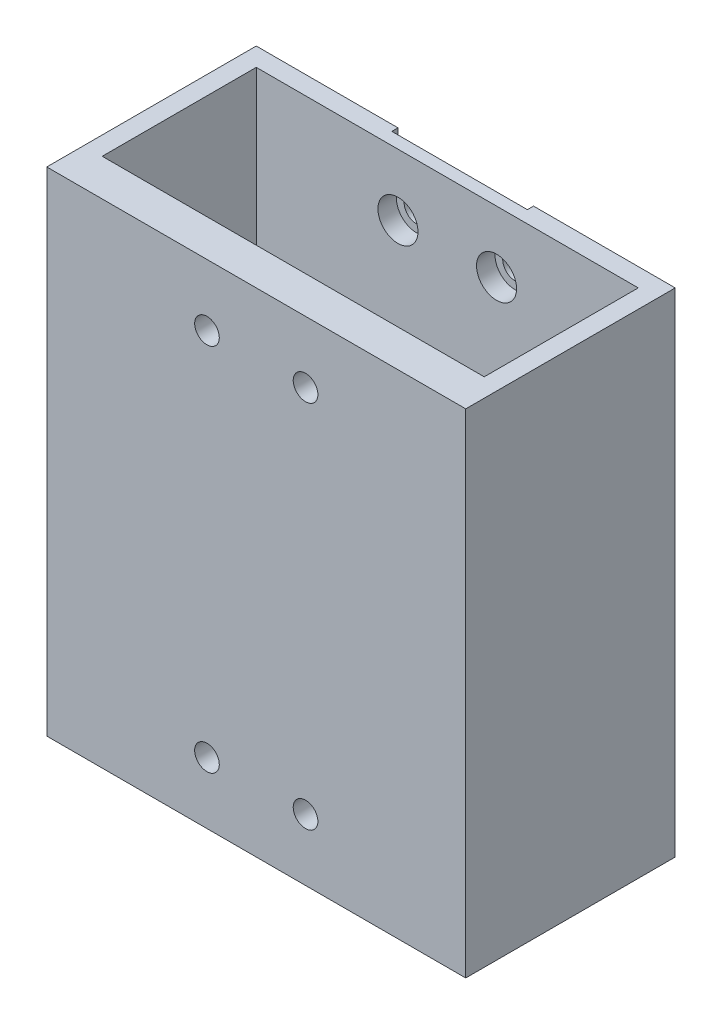
ISO-10303-21;
HEADER;
FILE_DESCRIPTION(('STEP AP214'),'2;1');
FILE_NAME('part.step','',(''),(''),'','','');
FILE_SCHEMA(('AUTOMOTIVE_DESIGN { 1 0 10303 214 1 1 1 1 }'));
ENDSEC;
DATA;
#1=APPLICATION_CONTEXT('core data for automotive mechanical design processes');
#2=APPLICATION_PROTOCOL_DEFINITION('international standard','automotive_design',2000,#1);
#3=PRODUCT_CONTEXT('',#1,'mechanical');
#4=PRODUCT('Part','Part','',(#3));
#5=PRODUCT_RELATED_PRODUCT_CATEGORY('part','',(#4));
#6=PRODUCT_DEFINITION_FORMATION('','',#4);
#7=PRODUCT_DEFINITION_CONTEXT('part definition',#1,'design');
#8=PRODUCT_DEFINITION('design','',#6,#7);
#9=PRODUCT_DEFINITION_SHAPE('','',#8);
#10=(LENGTH_UNIT() NAMED_UNIT(*) SI_UNIT(.MILLI.,.METRE.));
#11=(NAMED_UNIT(*) PLANE_ANGLE_UNIT() SI_UNIT($,.RADIAN.));
#12=(NAMED_UNIT(*) SI_UNIT($,.STERADIAN.) SOLID_ANGLE_UNIT());
#13=UNCERTAINTY_MEASURE_WITH_UNIT(LENGTH_MEASURE(1.E-05),#10,'distance_accuracy_value','');
#14=(GEOMETRIC_REPRESENTATION_CONTEXT(3) GLOBAL_UNCERTAINTY_ASSIGNED_CONTEXT((#13)) GLOBAL_UNIT_ASSIGNED_CONTEXT((#10,
#11,#12)) REPRESENTATION_CONTEXT('',''));
#15=CARTESIAN_POINT('',(0.,0.,0.));
#16=DIRECTION('',(0.,0.,1.));
#17=DIRECTION('',(1.,0.,0.));
#18=AXIS2_PLACEMENT_3D('',#15,#16,#17);
#19=CARTESIAN_POINT('',(7.99999999999999,-50.,-18.5));
#20=DIRECTION('',(0.,0.,1.));
#21=DIRECTION('',(1.,0.,0.));
#22=AXIS2_PLACEMENT_3D('',#19,#20,#21);
#23=CYLINDRICAL_SURFACE('',#22,2.);
#24=CARTESIAN_POINT('',(7.99999999999999,-50.,18.5));
#25=DIRECTION('',(0.,0.,-1.));
#26=DIRECTION('',(1.,0.,0.));
#27=AXIS2_PLACEMENT_3D('',#24,#25,#26);
#28=CIRCLE('',#27,2.);
#29=CARTESIAN_POINT('',(10.,-50.,18.5));
#30=VERTEX_POINT('',#29);
#31=EDGE_CURVE('E384',#30,#30,#28,.T.);
#32=ORIENTED_EDGE('',*,*,#31,.F.);
#33=EDGE_LOOP('',(#32));
#34=FACE_BOUND('',#33,.T.);
#35=CARTESIAN_POINT('',(7.99999999999999,-50.,15.5));
#36=DIRECTION('',(0.,0.,-1.));
#37=DIRECTION('',(-1.,0.,0.));
#38=AXIS2_PLACEMENT_3D('',#35,#36,#37);
#39=CIRCLE('',#38,2.);
#40=CARTESIAN_POINT('',(5.99999999999999,-50.,15.5));
#41=VERTEX_POINT('',#40);
#42=EDGE_CURVE('E44',#41,#41,#39,.T.);
#43=ORIENTED_EDGE('',*,*,#42,.T.);
#44=EDGE_LOOP('',(#43));
#45=FACE_BOUND('',#44,.T.);
#46=ADVANCED_FACE('F40',(#34,#45),#23,.F.);
#47=CARTESIAN_POINT('',(-8.00000000000001,-50.,-18.5));
#48=DIRECTION('',(0.,0.,1.));
#49=DIRECTION('',(1.,0.,0.));
#50=AXIS2_PLACEMENT_3D('',#47,#48,#49);
#51=CYLINDRICAL_SURFACE('',#50,2.);
#52=CARTESIAN_POINT('',(-8.00000000000001,-50.,18.5));
#53=DIRECTION('',(0.,0.,-1.));
#54=DIRECTION('',(1.,0.,0.));
#55=AXIS2_PLACEMENT_3D('',#52,#53,#54);
#56=CIRCLE('',#55,2.);
#57=CARTESIAN_POINT('',(-6.,-50.,18.5));
#58=VERTEX_POINT('',#57);
#59=EDGE_CURVE('E402',#58,#58,#56,.T.);
#60=ORIENTED_EDGE('',*,*,#59,.F.);
#61=EDGE_LOOP('',(#60));
#62=FACE_BOUND('',#61,.T.);
#63=CARTESIAN_POINT('',(-8.00000000000001,-50.,15.5));
#64=DIRECTION('',(0.,0.,-1.));
#65=DIRECTION('',(-1.,0.,0.));
#66=AXIS2_PLACEMENT_3D('',#63,#64,#65);
#67=CIRCLE('',#66,2.);
#68=CARTESIAN_POINT('',(-10.,-50.,15.5));
#69=VERTEX_POINT('',#68);
#70=EDGE_CURVE('E375',#69,#69,#67,.T.);
#71=ORIENTED_EDGE('',*,*,#70,.T.);
#72=EDGE_LOOP('',(#71));
#73=FACE_BOUND('',#72,.T.);
#74=ADVANCED_FACE('F463',(#62,#73),#51,.F.);
#75=CARTESIAN_POINT('',(7.99999999999999,10.,-18.5));
#76=DIRECTION('',(0.,0.,1.));
#77=DIRECTION('',(1.,0.,0.));
#78=AXIS2_PLACEMENT_3D('',#75,#76,#77);
#79=CYLINDRICAL_SURFACE('',#78,2.);
#80=CARTESIAN_POINT('',(7.99999999999999,10.,18.5));
#81=DIRECTION('',(0.,0.,1.));
#82=DIRECTION('',(1.,0.,0.));
#83=AXIS2_PLACEMENT_3D('',#80,#81,#82);
#84=CIRCLE('',#83,2.);
#85=CARTESIAN_POINT('',(10.,10.,18.5));
#86=VERTEX_POINT('',#85);
#87=EDGE_CURVE('E192',#86,#86,#84,.T.);
#88=ORIENTED_EDGE('',*,*,#87,.T.);
#89=EDGE_LOOP('',(#88));
#90=FACE_BOUND('',#89,.T.);
#91=CARTESIAN_POINT('',(7.99999999999999,10.,15.5));
#92=DIRECTION('',(0.,0.,-1.));
#93=DIRECTION('',(-1.,0.,0.));
#94=AXIS2_PLACEMENT_3D('',#91,#92,#93);
#95=CIRCLE('',#94,2.);
#96=CARTESIAN_POINT('',(5.99999999999999,10.,15.5));
#97=VERTEX_POINT('',#96);
#98=EDGE_CURVE('E371',#97,#97,#95,.F.);
#99=ORIENTED_EDGE('',*,*,#98,.F.);
#100=EDGE_LOOP('',(#99));
#101=FACE_BOUND('',#100,.T.);
#102=ADVANCED_FACE('F443',(#90,#101),#79,.F.);
#103=CARTESIAN_POINT('',(-8.00000000000001,10.,-18.5));
#104=DIRECTION('',(0.,0.,1.));
#105=DIRECTION('',(1.,0.,0.));
#106=AXIS2_PLACEMENT_3D('',#103,#104,#105);
#107=CYLINDRICAL_SURFACE('',#106,2.);
#108=CARTESIAN_POINT('',(-8.00000000000001,10.,18.5));
#109=DIRECTION('',(0.,0.,1.));
#110=DIRECTION('',(1.,0.,0.));
#111=AXIS2_PLACEMENT_3D('',#108,#109,#110);
#112=CIRCLE('',#111,2.);
#113=CARTESIAN_POINT('',(-6.,10.,18.5));
#114=VERTEX_POINT('',#113);
#115=EDGE_CURVE('E188',#114,#114,#112,.T.);
#116=ORIENTED_EDGE('',*,*,#115,.T.);
#117=EDGE_LOOP('',(#116));
#118=FACE_BOUND('',#117,.T.);
#119=CARTESIAN_POINT('',(-8.00000000000001,10.,15.5));
#120=DIRECTION('',(0.,0.,-1.));
#121=DIRECTION('',(-1.,0.,0.));
#122=AXIS2_PLACEMENT_3D('',#119,#120,#121);
#123=CIRCLE('',#122,2.);
#124=CARTESIAN_POINT('',(-10.,10.,15.5));
#125=VERTEX_POINT('',#124);
#126=EDGE_CURVE('E367',#125,#125,#123,.F.);
#127=ORIENTED_EDGE('',*,*,#126,.F.);
#128=EDGE_LOOP('',(#127));
#129=FACE_BOUND('',#128,.T.);
#130=ADVANCED_FACE('F552',(#118,#129),#107,.F.);
#131=CARTESIAN_POINT('',(-8.00000000000001,10.,-6.84314575050762));
#132=DIRECTION('',(0.,0.,-1.));
#133=DIRECTION('',(-1.,0.,0.));
#134=AXIS2_PLACEMENT_3D('',#131,#132,#133);
#135=CYLINDRICAL_SURFACE('',#134,2.);
#136=CARTESIAN_POINT('',(-8.00000000000001,10.,-18.5));
#137=DIRECTION('',(0.,0.,1.));
#138=DIRECTION('',(1.,0.,0.));
#139=AXIS2_PLACEMENT_3D('',#136,#137,#138);
#140=CIRCLE('',#139,2.);
#141=CARTESIAN_POINT('',(-6.,10.,-18.5));
#142=VERTEX_POINT('',#141);
#143=EDGE_CURVE('E236',#142,#142,#140,.T.);
#144=ORIENTED_EDGE('',*,*,#143,.F.);
#145=EDGE_LOOP('',(#144));
#146=FACE_BOUND('',#145,.T.);
#147=CARTESIAN_POINT('',(-8.00000000000001,10.,-15.5));
#148=DIRECTION('',(0.,0.,1.));
#149=DIRECTION('',(1.,0.,0.));
#150=AXIS2_PLACEMENT_3D('',#147,#148,#149);
#151=CIRCLE('',#150,2.);
#152=CARTESIAN_POINT('',(-6.00000000000001,10.,-15.5));
#153=VERTEX_POINT('',#152);
#154=EDGE_CURVE('E244',#153,#153,#151,.F.);
#155=ORIENTED_EDGE('',*,*,#154,.F.);
#156=EDGE_LOOP('',(#155));
#157=FACE_BOUND('',#156,.T.);
#158=ADVANCED_FACE('F549',(#146,#157),#135,.F.);
#159=CARTESIAN_POINT('',(7.99999999999999,10.,-6.84314575050762));
#160=DIRECTION('',(0.,0.,-1.));
#161=DIRECTION('',(-1.,0.,0.));
#162=AXIS2_PLACEMENT_3D('',#159,#160,#161);
#163=CYLINDRICAL_SURFACE('',#162,2.);
#164=CARTESIAN_POINT('',(7.99999999999999,10.,-18.5));
#165=DIRECTION('',(0.,0.,1.));
#166=DIRECTION('',(1.,0.,0.));
#167=AXIS2_PLACEMENT_3D('',#164,#165,#166);
#168=CIRCLE('',#167,2.);
#169=CARTESIAN_POINT('',(10.,10.,-18.5));
#170=VERTEX_POINT('',#169);
#171=EDGE_CURVE('E240',#170,#170,#168,.T.);
#172=ORIENTED_EDGE('',*,*,#171,.F.);
#173=EDGE_LOOP('',(#172));
#174=FACE_BOUND('',#173,.T.);
#175=CARTESIAN_POINT('',(7.99999999999999,10.,-15.5));
#176=DIRECTION('',(0.,0.,1.));
#177=DIRECTION('',(1.,0.,0.));
#178=AXIS2_PLACEMENT_3D('',#175,#176,#177);
#179=CIRCLE('',#178,2.);
#180=CARTESIAN_POINT('',(10.,10.,-15.5));
#181=VERTEX_POINT('',#180);
#182=EDGE_CURVE('E224',#181,#181,#179,.F.);
#183=ORIENTED_EDGE('',*,*,#182,.F.);
#184=EDGE_LOOP('',(#183));
#185=FACE_BOUND('',#184,.T.);
#186=ADVANCED_FACE('F494',(#174,#185),#163,.F.);
#187=CARTESIAN_POINT('',(-34.,20.,-15.5));
#188=DIRECTION('',(0.,0.,1.));
#189=DIRECTION('',(1.,0.,0.));
#190=AXIS2_PLACEMENT_3D('',#187,#188,#189);
#191=PLANE('',#190);
#192=CARTESIAN_POINT('',(-8.00000000000001,-50.,-15.5));
#193=DIRECTION('',(0.,0.,1.));
#194=DIRECTION('',(1.,0.,0.));
#195=AXIS2_PLACEMENT_3D('',#192,#193,#194);
#196=CIRCLE('',#195,2.);
#197=CARTESIAN_POINT('',(-6.,-50.,-15.5));
#198=VERTEX_POINT('',#197);
#199=EDGE_CURVE('E421',#198,#198,#196,.F.);
#200=ORIENTED_EDGE('',*,*,#199,.F.);
#201=EDGE_LOOP('',(#200));
#202=FACE_BOUND('',#201,.T.);
#203=CARTESIAN_POINT('',(7.99999999999999,-50.,-15.5));
#204=DIRECTION('',(0.,0.,1.));
#205=DIRECTION('',(1.,0.,0.));
#206=AXIS2_PLACEMENT_3D('',#203,#204,#205);
#207=CIRCLE('',#206,2.);
#208=CARTESIAN_POINT('',(10.,-50.,-15.5));
#209=VERTEX_POINT('',#208);
#210=EDGE_CURVE('E413',#209,#209,#207,.F.);
#211=ORIENTED_EDGE('',*,*,#210,.F.);
#212=EDGE_LOOP('',(#211));
#213=FACE_BOUND('',#212,.T.);
#214=DIRECTION('',(1.,0.,0.));
#215=VECTOR('',#214,1.);
#216=CARTESIAN_POINT('',(-11.,14.,-15.5));
#217=LINE('',#216,#215);
#218=CARTESIAN_POINT('',(11.,14.,-15.5));
#219=VERTEX_POINT('',#218);
#220=CARTESIAN_POINT('',(13.,14.,-15.5));
#221=VERTEX_POINT('',#220);
#222=EDGE_CURVE('E11',#219,#221,#217,.T.);
#223=ORIENTED_EDGE('',*,*,#222,.F.);
#224=DIRECTION('',(0.,1.,0.));
#225=VECTOR('',#224,1.);
#226=CARTESIAN_POINT('',(11.,14.,-15.5));
#227=LINE('',#226,#225);
#228=CARTESIAN_POINT('',(11.,20.,-15.5));
#229=VERTEX_POINT('',#228);
#230=EDGE_CURVE('E312',#219,#229,#227,.T.);
#231=ORIENTED_EDGE('',*,*,#230,.T.);
#232=DIRECTION('',(-1.,0.,0.));
#233=VECTOR('',#232,1.);
#234=CARTESIAN_POINT('',(-34.,20.,-15.5));
#235=LINE('',#234,#233);
#236=CARTESIAN_POINT('',(34.,20.,-15.5));
#237=VERTEX_POINT('',#236);
#238=EDGE_CURVE('E350',#237,#229,#235,.T.);
#239=ORIENTED_EDGE('',*,*,#238,.F.);
#240=DIRECTION('',(0.,-1.,0.));
#241=VECTOR('',#240,1.);
#242=CARTESIAN_POINT('',(34.,20.,-15.5));
#243=LINE('',#242,#241);
#244=CARTESIAN_POINT('',(34.,-60.,-15.5));
#245=VERTEX_POINT('',#244);
#246=EDGE_CURVE('E50',#237,#245,#243,.T.);
#247=ORIENTED_EDGE('',*,*,#246,.T.);
#248=DIRECTION('',(1.,0.,0.));
#249=VECTOR('',#248,1.);
#250=CARTESIAN_POINT('',(-34.,-60.,-15.5));
#251=LINE('',#250,#249);
#252=CARTESIAN_POINT('',(-34.,-60.,-15.5));
#253=VERTEX_POINT('',#252);
#254=EDGE_CURVE('E167',#253,#245,#251,.T.);
#255=ORIENTED_EDGE('',*,*,#254,.F.);
#256=DIRECTION('',(0.,-1.,0.));
#257=VECTOR('',#256,1.);
#258=CARTESIAN_POINT('',(-34.,20.,-15.5));
#259=LINE('',#258,#257);
#260=CARTESIAN_POINT('',(-34.,20.,-15.5));
#261=VERTEX_POINT('',#260);
#262=EDGE_CURVE('E162',#261,#253,#259,.T.);
#263=ORIENTED_EDGE('',*,*,#262,.F.);
#264=CARTESIAN_POINT('',(-11.,20.,-15.5));
#265=VERTEX_POINT('',#264);
#266=EDGE_CURVE('E349',#265,#261,#235,.T.);
#267=ORIENTED_EDGE('',*,*,#266,.F.);
#268=DIRECTION('',(0.,1.,0.));
#269=VECTOR('',#268,1.);
#270=CARTESIAN_POINT('',(-11.,14.,-15.5));
#271=LINE('',#270,#269);
#272=CARTESIAN_POINT('',(-11.,14.,-15.5));
#273=VERTEX_POINT('',#272);
#274=EDGE_CURVE('E308',#273,#265,#271,.T.);
#275=ORIENTED_EDGE('',*,*,#274,.F.);
#276=CARTESIAN_POINT('',(-13.,14.,-15.5));
#277=VERTEX_POINT('',#276);
#278=EDGE_CURVE('E52',#277,#273,#217,.T.);
#279=ORIENTED_EDGE('',*,*,#278,.F.);
#280=DIRECTION('',(0.,1.,0.));
#281=VECTOR('',#280,1.);
#282=CARTESIAN_POINT('',(-13.,14.,-15.5));
#283=LINE('',#282,#281);
#284=CARTESIAN_POINT('',(-13.,4.,-15.5));
#285=VERTEX_POINT('',#284);
#286=EDGE_CURVE('E265',#285,#277,#283,.T.);
#287=ORIENTED_EDGE('',*,*,#286,.F.);
#288=DIRECTION('',(-1.,0.,0.));
#289=VECTOR('',#288,1.);
#290=CARTESIAN_POINT('',(-13.,4.,-15.5));
#291=LINE('',#290,#289);
#292=CARTESIAN_POINT('',(13.,4.,-15.5));
#293=VERTEX_POINT('',#292);
#294=EDGE_CURVE('E261',#293,#285,#291,.T.);
#295=ORIENTED_EDGE('',*,*,#294,.F.);
#296=DIRECTION('',(0.,-1.,0.));
#297=VECTOR('',#296,1.);
#298=CARTESIAN_POINT('',(13.,14.,-15.5));
#299=LINE('',#298,#297);
#300=EDGE_CURVE('E59',#221,#293,#299,.T.);
#301=ORIENTED_EDGE('',*,*,#300,.F.);
#302=EDGE_LOOP('',(#223,#231,#239,#247,#255,#263,#267,#275,#279,#287,#295,#301));
#303=FACE_BOUND('',#302,.T.);
#304=ADVANCED_FACE('F491',(#202,#213,#303),#191,.F.);
#305=CARTESIAN_POINT('',(0.,20.,0.));
#306=DIRECTION('',(0.,1.,0.));
#307=DIRECTION('',(0.,0.,1.));
#308=AXIS2_PLACEMENT_3D('',#305,#306,#307);
#309=PLANE('',#308);
#310=DIRECTION('',(0.,0.,1.));
#311=VECTOR('',#310,1.);
#312=CARTESIAN_POINT('',(-11.,20.,-15.5));
#313=LINE('',#312,#311);
#314=CARTESIAN_POINT('',(-11.,20.,-14.5));
#315=VERTEX_POINT('',#314);
#316=EDGE_CURVE('E284',#265,#315,#313,.T.);
#317=ORIENTED_EDGE('',*,*,#316,.F.);
#318=ORIENTED_EDGE('',*,*,#266,.T.);
#319=DIRECTION('',(0.,0.,1.));
#320=VECTOR('',#319,1.);
#321=CARTESIAN_POINT('',(-34.,20.,-15.5));
#322=LINE('',#321,#320);
#323=CARTESIAN_POINT('',(-34.,20.,18.5));
#324=VERTEX_POINT('',#323);
#325=EDGE_CURVE('E354',#261,#324,#322,.T.);
#326=ORIENTED_EDGE('',*,*,#325,.T.);
#327=DIRECTION('',(-1.,0.,0.));
#328=VECTOR('',#327,1.);
#329=CARTESIAN_POINT('',(-34.,20.,18.5));
#330=LINE('',#329,#328);
#331=CARTESIAN_POINT('',(34.,20.,18.5));
#332=VERTEX_POINT('',#331);
#333=EDGE_CURVE('E186',#332,#324,#330,.T.);
#334=ORIENTED_EDGE('',*,*,#333,.F.);
#335=DIRECTION('',(0.,0.,-1.));
#336=VECTOR('',#335,1.);
#337=CARTESIAN_POINT('',(34.,20.,-15.5));
#338=LINE('',#337,#336);
#339=EDGE_CURVE('E345',#332,#237,#338,.T.);
#340=ORIENTED_EDGE('',*,*,#339,.T.);
#341=ORIENTED_EDGE('',*,*,#238,.T.);
#342=DIRECTION('',(0.,0.,-1.));
#343=VECTOR('',#342,1.);
#344=CARTESIAN_POINT('',(11.,20.,-15.5));
#345=LINE('',#344,#343);
#346=CARTESIAN_POINT('',(11.,20.,-14.5));
#347=VERTEX_POINT('',#346);
#348=EDGE_CURVE('E290',#347,#229,#345,.T.);
#349=ORIENTED_EDGE('',*,*,#348,.F.);
#350=DIRECTION('',(1.,0.,0.));
#351=VECTOR('',#350,1.);
#352=CARTESIAN_POINT('',(-11.,20.,-14.5));
#353=LINE('',#352,#351);
#354=EDGE_CURVE('E302',#315,#347,#353,.T.);
#355=ORIENTED_EDGE('',*,*,#354,.F.);
#356=EDGE_LOOP('',(#317,#318,#326,#334,#340,#341,#349,#355));
#357=FACE_BOUND('',#356,.T.);
#358=DIRECTION('',(-1.,0.,0.));
#359=VECTOR('',#358,1.);
#360=CARTESIAN_POINT('',(-31.,20.,-12.5));
#361=LINE('',#360,#359);
#362=CARTESIAN_POINT('',(31.,20.,-12.5));
#363=VERTEX_POINT('',#362);
#364=CARTESIAN_POINT('',(-31.,20.,-12.5));
#365=VERTEX_POINT('',#364);
#366=EDGE_CURVE('E323',#363,#365,#361,.T.);
#367=ORIENTED_EDGE('',*,*,#366,.F.);
#368=DIRECTION('',(0.,0.,-1.));
#369=VECTOR('',#368,1.);
#370=CARTESIAN_POINT('',(31.,20.,-12.5));
#371=LINE('',#370,#369);
#372=CARTESIAN_POINT('',(31.,20.,12.5));
#373=VERTEX_POINT('',#372);
#374=EDGE_CURVE('E311',#373,#363,#371,.T.);
#375=ORIENTED_EDGE('',*,*,#374,.F.);
#376=DIRECTION('',(1.,0.,0.));
#377=VECTOR('',#376,1.);
#378=CARTESIAN_POINT('',(-31.,20.,12.5));
#379=LINE('',#378,#377);
#380=CARTESIAN_POINT('',(-31.,20.,12.5));
#381=VERTEX_POINT('',#380);
#382=EDGE_CURVE('E330',#381,#373,#379,.T.);
#383=ORIENTED_EDGE('',*,*,#382,.F.);
#384=DIRECTION('',(0.,0.,1.));
#385=VECTOR('',#384,1.);
#386=CARTESIAN_POINT('',(-31.,20.,-12.5));
#387=LINE('',#386,#385);
#388=EDGE_CURVE('E326',#365,#381,#387,.T.);
#389=ORIENTED_EDGE('',*,*,#388,.F.);
#390=EDGE_LOOP('',(#367,#375,#383,#389));
#391=FACE_BOUND('',#390,.T.);
#392=ADVANCED_FACE('F493',(#357,#391),#309,.T.);
#393=CARTESIAN_POINT('',(34.,20.,-15.5));
#394=DIRECTION('',(-1.,0.,0.));
#395=DIRECTION('',(0.,0.,1.));
#396=AXIS2_PLACEMENT_3D('',#393,#394,#395);
#397=PLANE('',#396);
#398=ORIENTED_EDGE('',*,*,#339,.F.);
#399=DIRECTION('',(0.,1.,0.));
#400=VECTOR('',#399,1.);
#401=CARTESIAN_POINT('',(34.,20.,18.5));
#402=LINE('',#401,#400);
#403=CARTESIAN_POINT('',(34.,-60.,18.5));
#404=VERTEX_POINT('',#403);
#405=EDGE_CURVE('E180',#404,#332,#402,.T.);
#406=ORIENTED_EDGE('',*,*,#405,.F.);
#407=DIRECTION('',(0.,0.,1.));
#408=VECTOR('',#407,1.);
#409=CARTESIAN_POINT('',(34.,-60.,15.5));
#410=LINE('',#409,#408);
#411=EDGE_CURVE('E175',#245,#404,#410,.T.);
#412=ORIENTED_EDGE('',*,*,#411,.F.);
#413=ORIENTED_EDGE('',*,*,#246,.F.);
#414=EDGE_LOOP('',(#398,#406,#412,#413));
#415=FACE_BOUND('',#414,.T.);
#416=ADVANCED_FACE('F42',(#415),#397,.F.);
#417=CARTESIAN_POINT('',(-34.,20.,-15.5));
#418=DIRECTION('',(1.,0.,0.));
#419=DIRECTION('',(0.,0.,-1.));
#420=AXIS2_PLACEMENT_3D('',#417,#418,#419);
#421=PLANE('',#420);
#422=ORIENTED_EDGE('',*,*,#262,.T.);
#423=DIRECTION('',(0.,0.,-1.));
#424=VECTOR('',#423,1.);
#425=CARTESIAN_POINT('',(-34.,-60.,15.5));
#426=LINE('',#425,#424);
#427=CARTESIAN_POINT('',(-34.,-60.,18.5));
#428=VERTEX_POINT('',#427);
#429=EDGE_CURVE('E155',#428,#253,#426,.T.);
#430=ORIENTED_EDGE('',*,*,#429,.F.);
#431=DIRECTION('',(0.,-1.,0.));
#432=VECTOR('',#431,1.);
#433=CARTESIAN_POINT('',(-34.,20.,18.5));
#434=LINE('',#433,#432);
#435=EDGE_CURVE('E160',#324,#428,#434,.T.);
#436=ORIENTED_EDGE('',*,*,#435,.F.);
#437=ORIENTED_EDGE('',*,*,#325,.F.);
#438=EDGE_LOOP('',(#422,#430,#436,#437));
#439=FACE_BOUND('',#438,.T.);
#440=ADVANCED_FACE('F157',(#439),#421,.F.);
#441=CARTESIAN_POINT('',(31.,20.,-12.5));
#442=DIRECTION('',(-1.,0.,0.));
#443=DIRECTION('',(0.,0.,1.));
#444=AXIS2_PLACEMENT_3D('',#441,#442,#443);
#445=PLANE('',#444);
#446=DIRECTION('',(0.,-1.,0.));
#447=VECTOR('',#446,1.);
#448=CARTESIAN_POINT('',(31.,20.,-12.5));
#449=LINE('',#448,#447);
#450=CARTESIAN_POINT('',(31.,-60.,-12.5));
#451=VERTEX_POINT('',#450);
#452=EDGE_CURVE('E342',#363,#451,#449,.T.);
#453=ORIENTED_EDGE('',*,*,#452,.T.);
#454=DIRECTION('',(0.,0.,1.));
#455=VECTOR('',#454,1.);
#456=CARTESIAN_POINT('',(31.,-60.,12.5));
#457=LINE('',#456,#455);
#458=CARTESIAN_POINT('',(31.,-60.,12.5));
#459=VERTEX_POINT('',#458);
#460=EDGE_CURVE('E208',#451,#459,#457,.T.);
#461=ORIENTED_EDGE('',*,*,#460,.T.);
#462=DIRECTION('',(0.,-1.,0.));
#463=VECTOR('',#462,1.);
#464=CARTESIAN_POINT('',(31.,20.,12.5));
#465=LINE('',#464,#463);
#466=EDGE_CURVE('E333',#373,#459,#465,.T.);
#467=ORIENTED_EDGE('',*,*,#466,.F.);
#468=ORIENTED_EDGE('',*,*,#374,.T.);
#469=EDGE_LOOP('',(#453,#461,#467,#468));
#470=FACE_BOUND('',#469,.T.);
#471=ADVANCED_FACE('F573',(#470),#445,.T.);
#472=CARTESIAN_POINT('',(-31.,20.,-12.5));
#473=DIRECTION('',(0.,0.,1.));
#474=DIRECTION('',(1.,0.,0.));
#475=AXIS2_PLACEMENT_3D('',#472,#473,#474);
#476=PLANE('',#475);
#477=CARTESIAN_POINT('',(-8.00000000000001,-50.,-12.5));
#478=DIRECTION('',(0.,0.,1.));
#479=DIRECTION('',(1.,0.,0.));
#480=AXIS2_PLACEMENT_3D('',#477,#478,#479);
#481=CIRCLE('',#480,2.);
#482=CARTESIAN_POINT('',(-6.,-50.,-12.5));
#483=VERTEX_POINT('',#482);
#484=EDGE_CURVE('E417',#483,#483,#481,.F.);
#485=ORIENTED_EDGE('',*,*,#484,.T.);
#486=EDGE_LOOP('',(#485));
#487=FACE_BOUND('',#486,.T.);
#488=CARTESIAN_POINT('',(7.99999999999999,-50.,-12.5));
#489=DIRECTION('',(0.,0.,1.));
#490=DIRECTION('',(1.,0.,0.));
#491=AXIS2_PLACEMENT_3D('',#488,#489,#490);
#492=CIRCLE('',#491,2.);
#493=CARTESIAN_POINT('',(10.,-50.,-12.5));
#494=VERTEX_POINT('',#493);
#495=EDGE_CURVE('E406',#494,#494,#492,.F.);
#496=ORIENTED_EDGE('',*,*,#495,.T.);
#497=EDGE_LOOP('',(#496));
#498=FACE_BOUND('',#497,.T.);
#499=CARTESIAN_POINT('',(-8.00000000000001,10.,-12.5));
#500=DIRECTION('',(0.,0.,1.));
#501=DIRECTION('',(1.,0.,0.));
#502=AXIS2_PLACEMENT_3D('',#499,#500,#501);
#503=CIRCLE('',#502,3.25);
#504=CARTESIAN_POINT('',(-4.75,10.,-12.5));
#505=VERTEX_POINT('',#504);
#506=EDGE_CURVE('E225',#505,#505,#503,.T.);
#507=ORIENTED_EDGE('',*,*,#506,.F.);
#508=EDGE_LOOP('',(#507));
#509=FACE_BOUND('',#508,.T.);
#510=CARTESIAN_POINT('',(7.99999999999999,10.,-12.5));
#511=DIRECTION('',(0.,0.,1.));
#512=DIRECTION('',(1.,0.,0.));
#513=AXIS2_PLACEMENT_3D('',#510,#511,#512);
#514=CIRCLE('',#513,3.25);
#515=CARTESIAN_POINT('',(11.25,10.,-12.5));
#516=VERTEX_POINT('',#515);
#517=EDGE_CURVE('E219',#516,#516,#514,.T.);
#518=ORIENTED_EDGE('',*,*,#517,.F.);
#519=EDGE_LOOP('',(#518));
#520=FACE_BOUND('',#519,.T.);
#521=DIRECTION('',(0.,-1.,0.));
#522=VECTOR('',#521,1.);
#523=CARTESIAN_POINT('',(-31.,20.,-12.5));
#524=LINE('',#523,#522);
#525=CARTESIAN_POINT('',(-31.,-60.,-12.5));
#526=VERTEX_POINT('',#525);
#527=EDGE_CURVE('E339',#365,#526,#524,.T.);
#528=ORIENTED_EDGE('',*,*,#527,.T.);
#529=DIRECTION('',(1.,0.,0.));
#530=VECTOR('',#529,1.);
#531=CARTESIAN_POINT('',(-31.,-60.,-12.5));
#532=LINE('',#531,#530);
#533=EDGE_CURVE('E204',#526,#451,#532,.T.);
#534=ORIENTED_EDGE('',*,*,#533,.T.);
#535=ORIENTED_EDGE('',*,*,#452,.F.);
#536=ORIENTED_EDGE('',*,*,#366,.T.);
#537=EDGE_LOOP('',(#528,#534,#535,#536));
#538=FACE_BOUND('',#537,.T.);
#539=ADVANCED_FACE('F569',(#487,#498,#509,#520,#538),#476,.T.);
#540=CARTESIAN_POINT('',(-31.,20.,-12.5));
#541=DIRECTION('',(1.,0.,0.));
#542=DIRECTION('',(0.,0.,-1.));
#543=AXIS2_PLACEMENT_3D('',#540,#541,#542);
#544=PLANE('',#543);
#545=DIRECTION('',(0.,-1.,0.));
#546=VECTOR('',#545,1.);
#547=CARTESIAN_POINT('',(-31.,20.,12.5));
#548=LINE('',#547,#546);
#549=CARTESIAN_POINT('',(-31.,-60.,12.5));
#550=VERTEX_POINT('',#549);
#551=EDGE_CURVE('E336',#381,#550,#548,.T.);
#552=ORIENTED_EDGE('',*,*,#551,.T.);
#553=DIRECTION('',(0.,0.,-1.));
#554=VECTOR('',#553,1.);
#555=CARTESIAN_POINT('',(-31.,-60.,12.5));
#556=LINE('',#555,#554);
#557=EDGE_CURVE('E200',#550,#526,#556,.T.);
#558=ORIENTED_EDGE('',*,*,#557,.T.);
#559=ORIENTED_EDGE('',*,*,#527,.F.);
#560=ORIENTED_EDGE('',*,*,#388,.T.);
#561=EDGE_LOOP('',(#552,#558,#559,#560));
#562=FACE_BOUND('',#561,.T.);
#563=ADVANCED_FACE('F565',(#562),#544,.T.);
#564=CARTESIAN_POINT('',(-31.,20.,12.5));
#565=DIRECTION('',(0.,0.,-1.));
#566=DIRECTION('',(-1.,0.,0.));
#567=AXIS2_PLACEMENT_3D('',#564,#565,#566);
#568=PLANE('',#567);
#569=CARTESIAN_POINT('',(7.99999999999999,-50.,12.5));
#570=DIRECTION('',(0.,0.,1.));
#571=DIRECTION('',(-1.,0.,0.));
#572=AXIS2_PLACEMENT_3D('',#569,#570,#571);
#573=CIRCLE('',#572,6.);
#574=CARTESIAN_POINT('',(1.99999999999999,-50.,12.5));
#575=VERTEX_POINT('',#574);
#576=EDGE_CURVE('E386',#575,#575,#573,.T.);
#577=ORIENTED_EDGE('',*,*,#576,.T.);
#578=EDGE_LOOP('',(#577));
#579=FACE_BOUND('',#578,.T.);
#580=CARTESIAN_POINT('',(-8.00000000000001,-50.,12.5));
#581=DIRECTION('',(0.,0.,1.));
#582=DIRECTION('',(-1.,0.,0.));
#583=AXIS2_PLACEMENT_3D('',#580,#581,#582);
#584=CIRCLE('',#583,6.);
#585=CARTESIAN_POINT('',(-14.,-50.,12.5));
#586=VERTEX_POINT('',#585);
#587=EDGE_CURVE('E398',#586,#586,#584,.T.);
#588=ORIENTED_EDGE('',*,*,#587,.T.);
#589=EDGE_LOOP('',(#588));
#590=FACE_BOUND('',#589,.T.);
#591=CARTESIAN_POINT('',(7.99999999999999,10.,12.5));
#592=DIRECTION('',(0.,0.,-1.));
#593=DIRECTION('',(-1.,0.,0.));
#594=AXIS2_PLACEMENT_3D('',#591,#592,#593);
#595=CIRCLE('',#594,6.);
#596=CARTESIAN_POINT('',(1.99999999999999,10.,12.5));
#597=VERTEX_POINT('',#596);
#598=EDGE_CURVE('E429',#597,#597,#595,.T.);
#599=ORIENTED_EDGE('',*,*,#598,.F.);
#600=EDGE_LOOP('',(#599));
#601=FACE_BOUND('',#600,.T.);
#602=CARTESIAN_POINT('',(-8.00000000000001,10.,12.5));
#603=DIRECTION('',(0.,0.,-1.));
#604=DIRECTION('',(-1.,0.,0.));
#605=AXIS2_PLACEMENT_3D('',#602,#603,#604);
#606=CIRCLE('',#605,6.);
#607=CARTESIAN_POINT('',(-14.,10.,12.5));
#608=VERTEX_POINT('',#607);
#609=EDGE_CURVE('E425',#608,#608,#606,.T.);
#610=ORIENTED_EDGE('',*,*,#609,.F.);
#611=EDGE_LOOP('',(#610));
#612=FACE_BOUND('',#611,.T.);
#613=ORIENTED_EDGE('',*,*,#466,.T.);
#614=DIRECTION('',(-1.,0.,0.));
#615=VECTOR('',#614,1.);
#616=CARTESIAN_POINT('',(-31.,-60.,12.5));
#617=LINE('',#616,#615);
#618=EDGE_CURVE('E168',#459,#550,#617,.T.);
#619=ORIENTED_EDGE('',*,*,#618,.T.);
#620=ORIENTED_EDGE('',*,*,#551,.F.);
#621=ORIENTED_EDGE('',*,*,#382,.T.);
#622=EDGE_LOOP('',(#613,#619,#620,#621));
#623=FACE_BOUND('',#622,.T.);
#624=ADVANCED_FACE('F563',(#579,#590,#601,#612,#623),#568,.T.);
#625=CARTESIAN_POINT('',(-11.,14.,-15.5));
#626=DIRECTION('',(-1.,0.,0.));
#627=DIRECTION('',(0.,0.,1.));
#628=AXIS2_PLACEMENT_3D('',#625,#626,#627);
#629=PLANE('',#628);
#630=ORIENTED_EDGE('',*,*,#316,.T.);
#631=DIRECTION('',(0.,1.,0.));
#632=VECTOR('',#631,1.);
#633=CARTESIAN_POINT('',(-11.,14.,-14.5));
#634=LINE('',#633,#632);
#635=CARTESIAN_POINT('',(-11.,14.,-14.5));
#636=VERTEX_POINT('',#635);
#637=EDGE_CURVE('E298',#636,#315,#634,.T.);
#638=ORIENTED_EDGE('',*,*,#637,.F.);
#639=DIRECTION('',(0.,0.,1.));
#640=VECTOR('',#639,1.);
#641=CARTESIAN_POINT('',(-11.,14.,-15.5));
#642=LINE('',#641,#640);
#643=EDGE_CURVE('E285',#273,#636,#642,.T.);
#644=ORIENTED_EDGE('',*,*,#643,.F.);
#645=ORIENTED_EDGE('',*,*,#274,.T.);
#646=EDGE_LOOP('',(#630,#638,#644,#645));
#647=FACE_BOUND('',#646,.T.);
#648=ADVANCED_FACE('F557',(#647),#629,.F.);
#649=CARTESIAN_POINT('',(11.,14.,-15.5));
#650=DIRECTION('',(1.,0.,0.));
#651=DIRECTION('',(0.,0.,-1.));
#652=AXIS2_PLACEMENT_3D('',#649,#650,#651);
#653=PLANE('',#652);
#654=ORIENTED_EDGE('',*,*,#348,.T.);
#655=ORIENTED_EDGE('',*,*,#230,.F.);
#656=DIRECTION('',(0.,0.,-1.));
#657=VECTOR('',#656,1.);
#658=CARTESIAN_POINT('',(11.,14.,-15.5));
#659=LINE('',#658,#657);
#660=CARTESIAN_POINT('',(11.,14.,-14.5));
#661=VERTEX_POINT('',#660);
#662=EDGE_CURVE('E294',#661,#219,#659,.T.);
#663=ORIENTED_EDGE('',*,*,#662,.F.);
#664=DIRECTION('',(0.,1.,0.));
#665=VECTOR('',#664,1.);
#666=CARTESIAN_POINT('',(11.,14.,-14.5));
#667=LINE('',#666,#665);
#668=EDGE_CURVE('E316',#661,#347,#667,.T.);
#669=ORIENTED_EDGE('',*,*,#668,.T.);
#670=EDGE_LOOP('',(#654,#655,#663,#669));
#671=FACE_BOUND('',#670,.T.);
#672=ADVANCED_FACE('F503',(#671),#653,.F.);
#673=CARTESIAN_POINT('',(-11.,14.,-14.5));
#674=DIRECTION('',(0.,0.,1.));
#675=DIRECTION('',(1.,0.,0.));
#676=AXIS2_PLACEMENT_3D('',#673,#674,#675);
#677=PLANE('',#676);
#678=ORIENTED_EDGE('',*,*,#354,.T.);
#679=ORIENTED_EDGE('',*,*,#668,.F.);
#680=DIRECTION('',(1.,0.,0.));
#681=VECTOR('',#680,1.);
#682=CARTESIAN_POINT('',(-11.,14.,-14.5));
#683=LINE('',#682,#681);
#684=EDGE_CURVE('E289',#636,#661,#683,.T.);
#685=ORIENTED_EDGE('',*,*,#684,.F.);
#686=ORIENTED_EDGE('',*,*,#637,.T.);
#687=EDGE_LOOP('',(#678,#679,#685,#686));
#688=FACE_BOUND('',#687,.T.);
#689=ADVANCED_FACE('F536',(#688),#677,.F.);
#690=CARTESIAN_POINT('',(0.,14.,0.));
#691=DIRECTION('',(0.,1.,0.));
#692=DIRECTION('',(0.,0.,1.));
#693=AXIS2_PLACEMENT_3D('',#690,#691,#692);
#694=PLANE('',#693);
#695=ORIENTED_EDGE('',*,*,#643,.T.);
#696=ORIENTED_EDGE('',*,*,#684,.T.);
#697=ORIENTED_EDGE('',*,*,#662,.T.);
#698=ORIENTED_EDGE('',*,*,#222,.T.);
#699=DIRECTION('',(0.,0.,1.));
#700=VECTOR('',#699,1.);
#701=CARTESIAN_POINT('',(13.,14.,-18.5));
#702=LINE('',#701,#700);
#703=CARTESIAN_POINT('',(13.,14.,-18.5));
#704=VERTEX_POINT('',#703);
#705=EDGE_CURVE('E280',#704,#221,#702,.T.);
#706=ORIENTED_EDGE('',*,*,#705,.F.);
#707=DIRECTION('',(1.,0.,0.));
#708=VECTOR('',#707,1.);
#709=CARTESIAN_POINT('',(11.,14.,-18.5));
#710=LINE('',#709,#708);
#711=CARTESIAN_POINT('',(-13.,14.,-18.5));
#712=VERTEX_POINT('',#711);
#713=EDGE_CURVE('E245',#712,#704,#710,.T.);
#714=ORIENTED_EDGE('',*,*,#713,.F.);
#715=DIRECTION('',(0.,0.,1.));
#716=VECTOR('',#715,1.);
#717=CARTESIAN_POINT('',(-13.,14.,-18.5));
#718=LINE('',#717,#716);
#719=EDGE_CURVE('E258',#712,#277,#718,.T.);
#720=ORIENTED_EDGE('',*,*,#719,.T.);
#721=ORIENTED_EDGE('',*,*,#278,.T.);
#722=EDGE_LOOP('',(#695,#696,#697,#698,#706,#714,#720,#721));
#723=FACE_BOUND('',#722,.T.);
#724=ADVANCED_FACE('F500',(#723),#694,.T.);
#725=CARTESIAN_POINT('',(0.,0.,-18.5));
#726=DIRECTION('',(0.,0.,1.));
#727=DIRECTION('',(1.,0.,0.));
#728=AXIS2_PLACEMENT_3D('',#725,#726,#727);
#729=PLANE('',#728);
#730=ORIENTED_EDGE('',*,*,#143,.T.);
#731=EDGE_LOOP('',(#730));
#732=FACE_BOUND('',#731,.T.);
#733=ORIENTED_EDGE('',*,*,#171,.T.);
#734=EDGE_LOOP('',(#733));
#735=FACE_BOUND('',#734,.T.);
#736=ORIENTED_EDGE('',*,*,#713,.T.);
#737=DIRECTION('',(0.,-1.,0.));
#738=VECTOR('',#737,1.);
#739=CARTESIAN_POINT('',(13.,14.,-18.5));
#740=LINE('',#739,#738);
#741=CARTESIAN_POINT('',(13.,4.,-18.5));
#742=VERTEX_POINT('',#741);
#743=EDGE_CURVE('E248',#704,#742,#740,.T.);
#744=ORIENTED_EDGE('',*,*,#743,.T.);
#745=DIRECTION('',(-1.,0.,0.));
#746=VECTOR('',#745,1.);
#747=CARTESIAN_POINT('',(13.,4.,-18.5));
#748=LINE('',#747,#746);
#749=CARTESIAN_POINT('',(-13.,4.,-18.5));
#750=VERTEX_POINT('',#749);
#751=EDGE_CURVE('E251',#742,#750,#748,.T.);
#752=ORIENTED_EDGE('',*,*,#751,.T.);
#753=DIRECTION('',(0.,1.,0.));
#754=VECTOR('',#753,1.);
#755=CARTESIAN_POINT('',(-13.,14.,-18.5));
#756=LINE('',#755,#754);
#757=EDGE_CURVE('E254',#750,#712,#756,.T.);
#758=ORIENTED_EDGE('',*,*,#757,.T.);
#759=EDGE_LOOP('',(#736,#744,#752,#758));
#760=FACE_BOUND('',#759,.T.);
#761=ADVANCED_FACE('F527',(#732,#735,#760),#729,.F.);
#762=CARTESIAN_POINT('',(-13.,14.,-18.5));
#763=DIRECTION('',(1.,0.,0.));
#764=DIRECTION('',(0.,0.,-1.));
#765=AXIS2_PLACEMENT_3D('',#762,#763,#764);
#766=PLANE('',#765);
#767=ORIENTED_EDGE('',*,*,#286,.T.);
#768=ORIENTED_EDGE('',*,*,#719,.F.);
#769=ORIENTED_EDGE('',*,*,#757,.F.);
#770=DIRECTION('',(0.,0.,1.));
#771=VECTOR('',#770,1.);
#772=CARTESIAN_POINT('',(-13.,4.,-18.5));
#773=LINE('',#772,#771);
#774=EDGE_CURVE('E272',#750,#285,#773,.T.);
#775=ORIENTED_EDGE('',*,*,#774,.T.);
#776=EDGE_LOOP('',(#767,#768,#769,#775));
#777=FACE_BOUND('',#776,.T.);
#778=ADVANCED_FACE('F517',(#777),#766,.F.);
#779=CARTESIAN_POINT('',(-13.,4.,-18.5));
#780=DIRECTION('',(0.,1.,0.));
#781=DIRECTION('',(0.,0.,1.));
#782=AXIS2_PLACEMENT_3D('',#779,#780,#781);
#783=PLANE('',#782);
#784=ORIENTED_EDGE('',*,*,#294,.T.);
#785=ORIENTED_EDGE('',*,*,#774,.F.);
#786=ORIENTED_EDGE('',*,*,#751,.F.);
#787=DIRECTION('',(0.,0.,1.));
#788=VECTOR('',#787,1.);
#789=CARTESIAN_POINT('',(13.,4.,-18.5));
#790=LINE('',#789,#788);
#791=EDGE_CURVE('E276',#742,#293,#790,.T.);
#792=ORIENTED_EDGE('',*,*,#791,.T.);
#793=EDGE_LOOP('',(#784,#785,#786,#792));
#794=FACE_BOUND('',#793,.T.);
#795=ADVANCED_FACE('F520',(#794),#783,.F.);
#796=CARTESIAN_POINT('',(13.,14.,-18.5));
#797=DIRECTION('',(-1.,0.,0.));
#798=DIRECTION('',(0.,-1.,0.));
#799=AXIS2_PLACEMENT_3D('',#796,#797,#798);
#800=PLANE('',#799);
#801=ORIENTED_EDGE('',*,*,#300,.T.);
#802=ORIENTED_EDGE('',*,*,#791,.F.);
#803=ORIENTED_EDGE('',*,*,#743,.F.);
#804=ORIENTED_EDGE('',*,*,#705,.T.);
#805=EDGE_LOOP('',(#801,#802,#803,#804));
#806=FACE_BOUND('',#805,.T.);
#807=ADVANCED_FACE('F525',(#806),#800,.F.);
#808=CARTESIAN_POINT('',(7.99999999999999,10.,-15.5));
#809=DIRECTION('',(0.,0.,1.));
#810=DIRECTION('',(1.,0.,0.));
#811=AXIS2_PLACEMENT_3D('',#808,#809,#810);
#812=PLANE('',#811);
#813=CARTESIAN_POINT('',(7.99999999999999,10.,-15.5));
#814=DIRECTION('',(0.,0.,1.));
#815=DIRECTION('',(1.,0.,0.));
#816=AXIS2_PLACEMENT_3D('',#813,#814,#815);
#817=CIRCLE('',#816,3.25);
#818=CARTESIAN_POINT('',(11.25,10.,-15.5));
#819=VERTEX_POINT('',#818);
#820=EDGE_CURVE('E229',#819,#819,#817,.T.);
#821=ORIENTED_EDGE('',*,*,#820,.T.);
#822=EDGE_LOOP('',(#821));
#823=FACE_BOUND('',#822,.T.);
#824=ORIENTED_EDGE('',*,*,#182,.T.);
#825=EDGE_LOOP('',(#824));
#826=FACE_BOUND('',#825,.T.);
#827=ADVANCED_FACE('F546',(#823,#826),#812,.T.);
#828=CARTESIAN_POINT('',(7.99999999999999,10.,-15.5));
#829=DIRECTION('',(0.,0.,1.));
#830=DIRECTION('',(1.,0.,0.));
#831=AXIS2_PLACEMENT_3D('',#828,#829,#830);
#832=CYLINDRICAL_SURFACE('',#831,3.25);
#833=ORIENTED_EDGE('',*,*,#820,.F.);
#834=EDGE_LOOP('',(#833));
#835=FACE_BOUND('',#834,.T.);
#836=ORIENTED_EDGE('',*,*,#517,.T.);
#837=EDGE_LOOP('',(#836));
#838=FACE_BOUND('',#837,.T.);
#839=ADVANCED_FACE('F703',(#835,#838),#832,.F.);
#840=CARTESIAN_POINT('',(-8.00000000000001,10.,-15.5));
#841=DIRECTION('',(0.,0.,1.));
#842=DIRECTION('',(1.,0.,0.));
#843=AXIS2_PLACEMENT_3D('',#840,#841,#842);
#844=PLANE('',#843);
#845=CARTESIAN_POINT('',(-8.00000000000001,10.,-15.5));
#846=DIRECTION('',(0.,0.,1.));
#847=DIRECTION('',(1.,0.,0.));
#848=AXIS2_PLACEMENT_3D('',#845,#846,#847);
#849=CIRCLE('',#848,3.25);
#850=CARTESIAN_POINT('',(-4.75,10.,-15.5));
#851=VERTEX_POINT('',#850);
#852=EDGE_CURVE('E220',#851,#851,#849,.T.);
#853=ORIENTED_EDGE('',*,*,#852,.T.);
#854=EDGE_LOOP('',(#853));
#855=FACE_BOUND('',#854,.T.);
#856=ORIENTED_EDGE('',*,*,#154,.T.);
#857=EDGE_LOOP('',(#856));
#858=FACE_BOUND('',#857,.T.);
#859=ADVANCED_FACE('F693',(#855,#858),#844,.T.);
#860=CARTESIAN_POINT('',(-8.00000000000001,10.,-15.5));
#861=DIRECTION('',(0.,0.,1.));
#862=DIRECTION('',(1.,0.,0.));
#863=AXIS2_PLACEMENT_3D('',#860,#861,#862);
#864=CYLINDRICAL_SURFACE('',#863,3.25);
#865=ORIENTED_EDGE('',*,*,#852,.F.);
#866=EDGE_LOOP('',(#865));
#867=FACE_BOUND('',#866,.T.);
#868=ORIENTED_EDGE('',*,*,#506,.T.);
#869=EDGE_LOOP('',(#868));
#870=FACE_BOUND('',#869,.T.);
#871=ADVANCED_FACE('F458',(#867,#870),#864,.F.);
#872=CARTESIAN_POINT('',(0.,-60.,0.));
#873=DIRECTION('',(0.,-1.,0.));
#874=DIRECTION('',(0.,0.,-1.));
#875=AXIS2_PLACEMENT_3D('',#872,#873,#874);
#876=PLANE('',#875);
#877=ORIENTED_EDGE('',*,*,#429,.T.);
#878=ORIENTED_EDGE('',*,*,#254,.T.);
#879=ORIENTED_EDGE('',*,*,#411,.T.);
#880=DIRECTION('',(1.,0.,0.));
#881=VECTOR('',#880,1.);
#882=CARTESIAN_POINT('',(-34.,-60.,18.5));
#883=LINE('',#882,#881);
#884=EDGE_CURVE('E171',#428,#404,#883,.T.);
#885=ORIENTED_EDGE('',*,*,#884,.F.);
#886=EDGE_LOOP('',(#877,#878,#879,#885));
#887=FACE_BOUND('',#886,.T.);
#888=ORIENTED_EDGE('',*,*,#533,.F.);
#889=ORIENTED_EDGE('',*,*,#557,.F.);
#890=ORIENTED_EDGE('',*,*,#618,.F.);
#891=ORIENTED_EDGE('',*,*,#460,.F.);
#892=EDGE_LOOP('',(#888,#889,#890,#891));
#893=FACE_BOUND('',#892,.T.);
#894=ADVANCED_FACE('F172',(#887,#893),#876,.T.);
#895=CARTESIAN_POINT('',(0.,0.,18.5));
#896=DIRECTION('',(0.,0.,1.));
#897=DIRECTION('',(1.,0.,0.));
#898=AXIS2_PLACEMENT_3D('',#895,#896,#897);
#899=PLANE('',#898);
#900=ORIENTED_EDGE('',*,*,#59,.T.);
#901=EDGE_LOOP('',(#900));
#902=FACE_BOUND('',#901,.T.);
#903=ORIENTED_EDGE('',*,*,#31,.T.);
#904=EDGE_LOOP('',(#903));
#905=FACE_BOUND('',#904,.T.);
#906=ORIENTED_EDGE('',*,*,#115,.F.);
#907=EDGE_LOOP('',(#906));
#908=FACE_BOUND('',#907,.T.);
#909=ORIENTED_EDGE('',*,*,#435,.T.);
#910=ORIENTED_EDGE('',*,*,#884,.T.);
#911=ORIENTED_EDGE('',*,*,#405,.T.);
#912=ORIENTED_EDGE('',*,*,#333,.T.);
#913=EDGE_LOOP('',(#909,#910,#911,#912));
#914=FACE_BOUND('',#913,.T.);
#915=ORIENTED_EDGE('',*,*,#87,.F.);
#916=EDGE_LOOP('',(#915));
#917=FACE_BOUND('',#916,.T.);
#918=ADVANCED_FACE('F183',(#902,#905,#908,#914,#917),#899,.T.);
#919=CARTESIAN_POINT('',(-8.00000000000001,10.,15.5));
#920=DIRECTION('',(0.,0.,-1.));
#921=DIRECTION('',(-1.,0.,0.));
#922=AXIS2_PLACEMENT_3D('',#919,#920,#921);
#923=PLANE('',#922);
#924=CARTESIAN_POINT('',(-8.00000000000001,10.,15.5));
#925=DIRECTION('',(0.,0.,-1.));
#926=DIRECTION('',(-1.,0.,0.));
#927=AXIS2_PLACEMENT_3D('',#924,#925,#926);
#928=CIRCLE('',#927,6.);
#929=CARTESIAN_POINT('',(-14.,10.,15.5));
#930=VERTEX_POINT('',#929);
#931=EDGE_CURVE('E433',#930,#930,#928,.T.);
#932=ORIENTED_EDGE('',*,*,#931,.T.);
#933=EDGE_LOOP('',(#932));
#934=FACE_BOUND('',#933,.T.);
#935=ORIENTED_EDGE('',*,*,#126,.T.);
#936=EDGE_LOOP('',(#935));
#937=FACE_BOUND('',#936,.T.);
#938=ADVANCED_FACE('F446',(#934,#937),#923,.T.);
#939=CARTESIAN_POINT('',(-8.00000000000001,10.,15.5));
#940=DIRECTION('',(0.,0.,-1.));
#941=DIRECTION('',(-1.,0.,0.));
#942=AXIS2_PLACEMENT_3D('',#939,#940,#941);
#943=CYLINDRICAL_SURFACE('',#942,6.);
#944=ORIENTED_EDGE('',*,*,#931,.F.);
#945=EDGE_LOOP('',(#944));
#946=FACE_BOUND('',#945,.T.);
#947=ORIENTED_EDGE('',*,*,#609,.T.);
#948=EDGE_LOOP('',(#947));
#949=FACE_BOUND('',#948,.T.);
#950=ADVANCED_FACE('F454',(#946,#949),#943,.F.);
#951=CARTESIAN_POINT('',(7.99999999999999,10.,15.5));
#952=DIRECTION('',(0.,0.,-1.));
#953=DIRECTION('',(-1.,0.,0.));
#954=AXIS2_PLACEMENT_3D('',#951,#952,#953);
#955=PLANE('',#954);
#956=CARTESIAN_POINT('',(7.99999999999999,10.,15.5));
#957=DIRECTION('',(0.,0.,-1.));
#958=DIRECTION('',(-1.,0.,0.));
#959=AXIS2_PLACEMENT_3D('',#956,#957,#958);
#960=CIRCLE('',#959,6.);
#961=CARTESIAN_POINT('',(1.99999999999999,10.,15.5));
#962=VERTEX_POINT('',#961);
#963=EDGE_CURVE('E372',#962,#962,#960,.T.);
#964=ORIENTED_EDGE('',*,*,#963,.T.);
#965=EDGE_LOOP('',(#964));
#966=FACE_BOUND('',#965,.T.);
#967=ORIENTED_EDGE('',*,*,#98,.T.);
#968=EDGE_LOOP('',(#967));
#969=FACE_BOUND('',#968,.T.);
#970=ADVANCED_FACE('F484',(#966,#969),#955,.T.);
#971=CARTESIAN_POINT('',(7.99999999999999,10.,15.5));
#972=DIRECTION('',(0.,0.,-1.));
#973=DIRECTION('',(-1.,0.,0.));
#974=AXIS2_PLACEMENT_3D('',#971,#972,#973);
#975=CYLINDRICAL_SURFACE('',#974,6.);
#976=ORIENTED_EDGE('',*,*,#963,.F.);
#977=EDGE_LOOP('',(#976));
#978=FACE_BOUND('',#977,.T.);
#979=ORIENTED_EDGE('',*,*,#598,.T.);
#980=EDGE_LOOP('',(#979));
#981=FACE_BOUND('',#980,.T.);
#982=ADVANCED_FACE('F478',(#978,#981),#975,.F.);
#983=ORIENTED_EDGE('',*,*,#495,.F.);
#984=EDGE_LOOP('',(#983));
#985=FACE_BOUND('',#984,.T.);
#986=ORIENTED_EDGE('',*,*,#210,.T.);
#987=EDGE_LOOP('',(#986));
#988=FACE_BOUND('',#987,.T.);
#989=ADVANCED_FACE('F466',(#985,#988),#23,.F.);
#990=ORIENTED_EDGE('',*,*,#484,.F.);
#991=EDGE_LOOP('',(#990));
#992=FACE_BOUND('',#991,.T.);
#993=ORIENTED_EDGE('',*,*,#199,.T.);
#994=EDGE_LOOP('',(#993));
#995=FACE_BOUND('',#994,.T.);
#996=ADVANCED_FACE('F473',(#992,#995),#51,.F.);
#997=CARTESIAN_POINT('',(-8.00000000000001,-50.,15.5));
#998=DIRECTION('',(0.,0.,-1.));
#999=DIRECTION('',(-1.,0.,0.));
#1000=AXIS2_PLACEMENT_3D('',#997,#998,#999);
#1001=CYLINDRICAL_SURFACE('',#1000,6.);
#1002=CARTESIAN_POINT('',(-8.00000000000001,-50.,15.5));
#1003=DIRECTION('',(0.,0.,1.));
#1004=DIRECTION('',(-1.,0.,0.));
#1005=AXIS2_PLACEMENT_3D('',#1002,#1003,#1004);
#1006=CIRCLE('',#1005,6.);
#1007=CARTESIAN_POINT('',(-14.,-50.,15.5));
#1008=VERTEX_POINT('',#1007);
#1009=EDGE_CURVE('E392',#1008,#1008,#1006,.T.);
#1010=ORIENTED_EDGE('',*,*,#1009,.T.);
#1011=EDGE_LOOP('',(#1010));
#1012=FACE_BOUND('',#1011,.T.);
#1013=ORIENTED_EDGE('',*,*,#587,.F.);
#1014=EDGE_LOOP('',(#1013));
#1015=FACE_BOUND('',#1014,.T.);
#1016=ADVANCED_FACE('F482',(#1012,#1015),#1001,.F.);
#1017=CARTESIAN_POINT('',(-8.00000000000001,-50.,15.5));
#1018=DIRECTION('',(0.,0.,-1.));
#1019=DIRECTION('',(-1.,0.,0.));
#1020=AXIS2_PLACEMENT_3D('',#1017,#1018,#1019);
#1021=PLANE('',#1020);
#1022=ORIENTED_EDGE('',*,*,#70,.F.);
#1023=EDGE_LOOP('',(#1022));
#1024=FACE_BOUND('',#1023,.T.);
#1025=ORIENTED_EDGE('',*,*,#1009,.F.);
#1026=EDGE_LOOP('',(#1025));
#1027=FACE_BOUND('',#1026,.T.);
#1028=ADVANCED_FACE('F879',(#1024,#1027),#1021,.T.);
#1029=CARTESIAN_POINT('',(7.99999999999999,-50.,15.5));
#1030=DIRECTION('',(0.,0.,-1.));
#1031=DIRECTION('',(-1.,0.,0.));
#1032=AXIS2_PLACEMENT_3D('',#1029,#1030,#1031);
#1033=CYLINDRICAL_SURFACE('',#1032,6.);
#1034=CARTESIAN_POINT('',(7.99999999999999,-50.,15.5));
#1035=DIRECTION('',(0.,0.,1.));
#1036=DIRECTION('',(-1.,0.,0.));
#1037=AXIS2_PLACEMENT_3D('',#1034,#1035,#1036);
#1038=CIRCLE('',#1037,6.);
#1039=CARTESIAN_POINT('',(1.99999999999999,-50.,15.5));
#1040=VERTEX_POINT('',#1039);
#1041=EDGE_CURVE('E378',#1040,#1040,#1038,.T.);
#1042=ORIENTED_EDGE('',*,*,#1041,.T.);
#1043=EDGE_LOOP('',(#1042));
#1044=FACE_BOUND('',#1043,.T.);
#1045=ORIENTED_EDGE('',*,*,#576,.F.);
#1046=EDGE_LOOP('',(#1045));
#1047=FACE_BOUND('',#1046,.T.);
#1048=ADVANCED_FACE('F889',(#1044,#1047),#1033,.F.);
#1049=CARTESIAN_POINT('',(7.99999999999999,-50.,15.5));
#1050=DIRECTION('',(0.,0.,-1.));
#1051=DIRECTION('',(-1.,0.,0.));
#1052=AXIS2_PLACEMENT_3D('',#1049,#1050,#1051);
#1053=PLANE('',#1052);
#1054=ORIENTED_EDGE('',*,*,#42,.F.);
#1055=EDGE_LOOP('',(#1054));
#1056=FACE_BOUND('',#1055,.T.);
#1057=ORIENTED_EDGE('',*,*,#1041,.F.);
#1058=EDGE_LOOP('',(#1057));
#1059=FACE_BOUND('',#1058,.T.);
#1060=ADVANCED_FACE('F899',(#1056,#1059),#1053,.T.);
#1061=CLOSED_SHELL('',(#46,#74,#102,#130,#158,#186,#304,#392,#416,#440,#471,#539,#563,#624,#648,
#672,#689,#724,#761,#778,#795,#807,#827,#839,#859,#871,#894,#918,#938,#950,#970,#982,#989,#996,
#1016,#1028,#1048,#1060));
#1062=MANIFOLD_SOLID_BREP('B2',#1061);
#1063=ADVANCED_BREP_SHAPE_REPRESENTATION('',(#18,#1062),#14);
#1064=SHAPE_DEFINITION_REPRESENTATION(#9,#1063);
ENDSEC;
END-ISO-10303-21;
